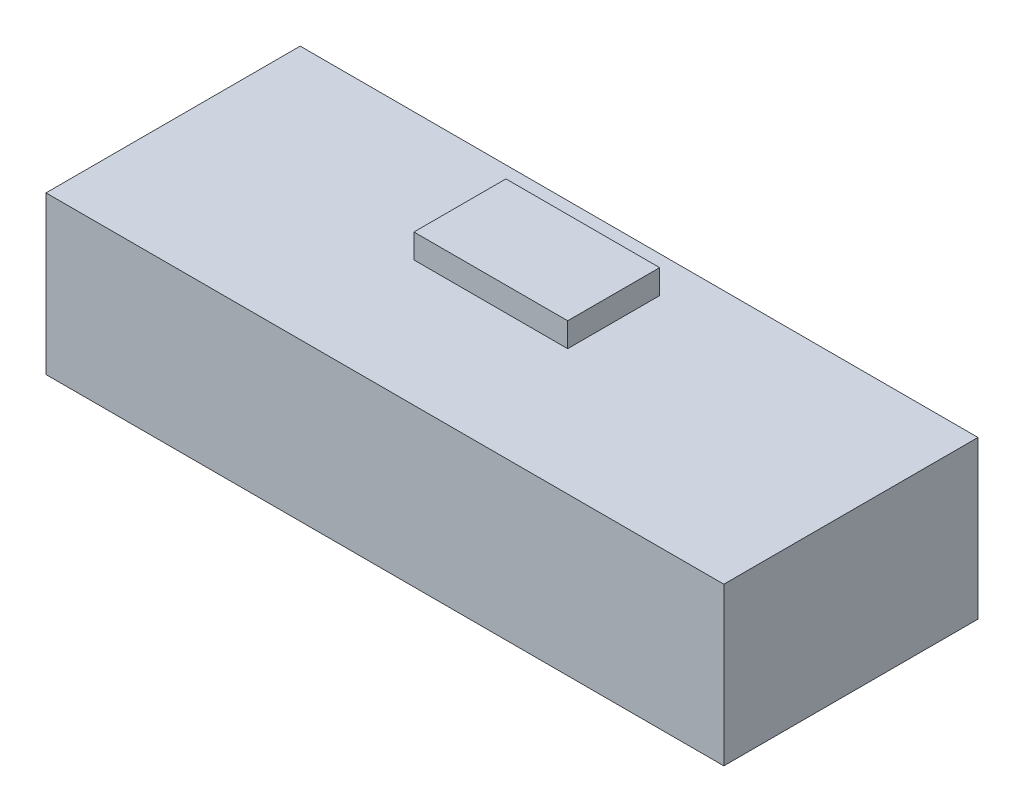
ISO-10303-21;
HEADER;
FILE_DESCRIPTION(('STEP AP214'),'2;1');
FILE_NAME('part.step','',(''),(''),'','','');
FILE_SCHEMA(('AUTOMOTIVE_DESIGN { 1 0 10303 214 1 1 1 1 }'));
ENDSEC;
DATA;
#1=APPLICATION_CONTEXT('core data for automotive mechanical design processes');
#2=APPLICATION_PROTOCOL_DEFINITION('international standard','automotive_design',2000,#1);
#3=PRODUCT_CONTEXT('',#1,'mechanical');
#4=PRODUCT('Part','Part','',(#3));
#5=PRODUCT_RELATED_PRODUCT_CATEGORY('part','',(#4));
#6=PRODUCT_DEFINITION_FORMATION('','',#4);
#7=PRODUCT_DEFINITION_CONTEXT('part definition',#1,'design');
#8=PRODUCT_DEFINITION('design','',#6,#7);
#9=PRODUCT_DEFINITION_SHAPE('','',#8);
#10=(LENGTH_UNIT() NAMED_UNIT(*) SI_UNIT(.MILLI.,.METRE.));
#11=(NAMED_UNIT(*) PLANE_ANGLE_UNIT() SI_UNIT($,.RADIAN.));
#12=(NAMED_UNIT(*) SI_UNIT($,.STERADIAN.) SOLID_ANGLE_UNIT());
#13=UNCERTAINTY_MEASURE_WITH_UNIT(LENGTH_MEASURE(1.E-05),#10,'distance_accuracy_value','');
#14=(GEOMETRIC_REPRESENTATION_CONTEXT(3) GLOBAL_UNCERTAINTY_ASSIGNED_CONTEXT((#13)) GLOBAL_UNIT_ASSIGNED_CONTEXT((#10,
#11,#12)) REPRESENTATION_CONTEXT('',''));
#15=CARTESIAN_POINT('',(0.,0.,0.));
#16=DIRECTION('',(0.,0.,1.));
#17=DIRECTION('',(1.,0.,0.));
#18=AXIS2_PLACEMENT_3D('',#15,#16,#17);
#19=CARTESIAN_POINT('',(-28.,13.,-10.5));
#20=DIRECTION('',(1.,0.,0.));
#21=DIRECTION('',(0.,0.,-1.));
#22=AXIS2_PLACEMENT_3D('',#19,#20,#21);
#23=PLANE('',#22);
#24=DIRECTION('',(0.,0.,1.));
#25=VECTOR('',#24,1.);
#26=CARTESIAN_POINT('',(-28.,0.,-10.5));
#27=LINE('',#26,#25);
#28=CARTESIAN_POINT('',(-28.,0.,-10.5));
#29=VERTEX_POINT('',#28);
#30=CARTESIAN_POINT('',(-28.,0.,10.5));
#31=VERTEX_POINT('',#30);
#32=EDGE_CURVE('E130',#29,#31,#27,.T.);
#33=ORIENTED_EDGE('',*,*,#32,.T.);
#34=DIRECTION('',(0.,-1.,0.));
#35=VECTOR('',#34,1.);
#36=CARTESIAN_POINT('',(-28.,13.,10.5));
#37=LINE('',#36,#35);
#38=CARTESIAN_POINT('',(-28.,13.,10.5));
#39=VERTEX_POINT('',#38);
#40=EDGE_CURVE('E11',#39,#31,#37,.T.);
#41=ORIENTED_EDGE('',*,*,#40,.F.);
#42=DIRECTION('',(0.,0.,1.));
#43=VECTOR('',#42,1.);
#44=CARTESIAN_POINT('',(-28.,13.,-10.5));
#45=LINE('',#44,#43);
#46=CARTESIAN_POINT('',(-28.,13.,-10.5));
#47=VERTEX_POINT('',#46);
#48=EDGE_CURVE('E136',#47,#39,#45,.T.);
#49=ORIENTED_EDGE('',*,*,#48,.F.);
#50=DIRECTION('',(0.,-1.,0.));
#51=VECTOR('',#50,1.);
#52=CARTESIAN_POINT('',(-28.,13.,-10.5));
#53=LINE('',#52,#51);
#54=EDGE_CURVE('E144',#47,#29,#53,.T.);
#55=ORIENTED_EDGE('',*,*,#54,.T.);
#56=EDGE_LOOP('',(#33,#41,#49,#55));
#57=FACE_BOUND('',#56,.T.);
#58=ADVANCED_FACE('F43',(#57),#23,.F.);
#59=CARTESIAN_POINT('',(-28.,13.,10.5));
#60=DIRECTION('',(0.,0.,-1.));
#61=DIRECTION('',(-1.,0.,0.));
#62=AXIS2_PLACEMENT_3D('',#59,#60,#61);
#63=PLANE('',#62);
#64=DIRECTION('',(1.,0.,0.));
#65=VECTOR('',#64,1.);
#66=CARTESIAN_POINT('',(-28.,0.,10.5));
#67=LINE('',#66,#65);
#68=CARTESIAN_POINT('',(28.,0.,10.5));
#69=VERTEX_POINT('',#68);
#70=EDGE_CURVE('E128',#31,#69,#67,.T.);
#71=ORIENTED_EDGE('',*,*,#70,.T.);
#72=DIRECTION('',(0.,-1.,0.));
#73=VECTOR('',#72,1.);
#74=CARTESIAN_POINT('',(28.,13.,10.5));
#75=LINE('',#74,#73);
#76=CARTESIAN_POINT('',(28.,13.,10.5));
#77=VERTEX_POINT('',#76);
#78=EDGE_CURVE('E49',#77,#69,#75,.T.);
#79=ORIENTED_EDGE('',*,*,#78,.F.);
#80=DIRECTION('',(1.,0.,0.));
#81=VECTOR('',#80,1.);
#82=CARTESIAN_POINT('',(-28.,13.,10.5));
#83=LINE('',#82,#81);
#84=EDGE_CURVE('E138',#39,#77,#83,.T.);
#85=ORIENTED_EDGE('',*,*,#84,.F.);
#86=ORIENTED_EDGE('',*,*,#40,.T.);
#87=EDGE_LOOP('',(#71,#79,#85,#86));
#88=FACE_BOUND('',#87,.T.);
#89=ADVANCED_FACE('F176',(#88),#63,.F.);
#90=CARTESIAN_POINT('',(28.,13.,10.5));
#91=DIRECTION('',(-1.,0.,0.));
#92=DIRECTION('',(0.,0.,1.));
#93=AXIS2_PLACEMENT_3D('',#90,#91,#92);
#94=PLANE('',#93);
#95=DIRECTION('',(0.,0.,-1.));
#96=VECTOR('',#95,1.);
#97=CARTESIAN_POINT('',(28.,0.,10.5));
#98=LINE('',#97,#96);
#99=CARTESIAN_POINT('',(28.,0.,-10.5));
#100=VERTEX_POINT('',#99);
#101=EDGE_CURVE('E146',#69,#100,#98,.T.);
#102=ORIENTED_EDGE('',*,*,#101,.T.);
#103=DIRECTION('',(0.,-1.,0.));
#104=VECTOR('',#103,1.);
#105=CARTESIAN_POINT('',(28.,13.,-10.5));
#106=LINE('',#105,#104);
#107=CARTESIAN_POINT('',(28.,13.,-10.5));
#108=VERTEX_POINT('',#107);
#109=EDGE_CURVE('E153',#108,#100,#106,.T.);
#110=ORIENTED_EDGE('',*,*,#109,.F.);
#111=DIRECTION('',(0.,0.,-1.));
#112=VECTOR('',#111,1.);
#113=CARTESIAN_POINT('',(28.,13.,10.5));
#114=LINE('',#113,#112);
#115=EDGE_CURVE('E142',#77,#108,#114,.T.);
#116=ORIENTED_EDGE('',*,*,#115,.F.);
#117=ORIENTED_EDGE('',*,*,#78,.T.);
#118=EDGE_LOOP('',(#102,#110,#116,#117));
#119=FACE_BOUND('',#118,.T.);
#120=ADVANCED_FACE('F159',(#119),#94,.F.);
#121=CARTESIAN_POINT('',(28.,13.,-10.5));
#122=DIRECTION('',(0.,0.,1.));
#123=DIRECTION('',(1.,0.,0.));
#124=AXIS2_PLACEMENT_3D('',#121,#122,#123);
#125=PLANE('',#124);
#126=DIRECTION('',(-1.,0.,0.));
#127=VECTOR('',#126,1.);
#128=CARTESIAN_POINT('',(28.,0.,-10.5));
#129=LINE('',#128,#127);
#130=EDGE_CURVE('E139',#100,#29,#129,.T.);
#131=ORIENTED_EDGE('',*,*,#130,.T.);
#132=ORIENTED_EDGE('',*,*,#54,.F.);
#133=DIRECTION('',(-1.,0.,0.));
#134=VECTOR('',#133,1.);
#135=CARTESIAN_POINT('',(28.,13.,-10.5));
#136=LINE('',#135,#134);
#137=EDGE_CURVE('E145',#108,#47,#136,.T.);
#138=ORIENTED_EDGE('',*,*,#137,.F.);
#139=ORIENTED_EDGE('',*,*,#109,.T.);
#140=EDGE_LOOP('',(#131,#132,#138,#139));
#141=FACE_BOUND('',#140,.T.);
#142=ADVANCED_FACE('F166',(#141),#125,.F.);
#143=CARTESIAN_POINT('',(0.,13.,0.));
#144=DIRECTION('',(0.,1.,0.));
#145=DIRECTION('',(0.,0.,1.));
#146=AXIS2_PLACEMENT_3D('',#143,#144,#145);
#147=PLANE('',#146);
#148=DIRECTION('',(0.,0.,1.));
#149=VECTOR('',#148,1.);
#150=CARTESIAN_POINT('',(-8.,13.,-7.5));
#151=LINE('',#150,#149);
#152=CARTESIAN_POINT('',(-8.,13.,-7.5));
#153=VERTEX_POINT('',#152);
#154=CARTESIAN_POINT('',(-8.,13.,0.1));
#155=VERTEX_POINT('',#154);
#156=EDGE_CURVE('E60',#153,#155,#151,.T.);
#157=ORIENTED_EDGE('',*,*,#156,.F.);
#158=DIRECTION('',(-1.,0.,0.));
#159=VECTOR('',#158,1.);
#160=CARTESIAN_POINT('',(4.7,13.,-7.5));
#161=LINE('',#160,#159);
#162=CARTESIAN_POINT('',(4.7,13.,-7.5));
#163=VERTEX_POINT('',#162);
#164=EDGE_CURVE('E62',#163,#153,#161,.T.);
#165=ORIENTED_EDGE('',*,*,#164,.F.);
#166=DIRECTION('',(0.,0.,-1.));
#167=VECTOR('',#166,1.);
#168=CARTESIAN_POINT('',(4.7,13.,0.1));
#169=LINE('',#168,#167);
#170=CARTESIAN_POINT('',(4.7,13.,0.1));
#171=VERTEX_POINT('',#170);
#172=EDGE_CURVE('E314',#171,#163,#169,.T.);
#173=ORIENTED_EDGE('',*,*,#172,.F.);
#174=DIRECTION('',(1.,0.,0.));
#175=VECTOR('',#174,1.);
#176=CARTESIAN_POINT('',(-8.,13.,0.1));
#177=LINE('',#176,#175);
#178=EDGE_CURVE('E319',#155,#171,#177,.T.);
#179=ORIENTED_EDGE('',*,*,#178,.F.);
#180=EDGE_LOOP('',(#157,#165,#173,#179));
#181=FACE_BOUND('',#180,.T.);
#182=ORIENTED_EDGE('',*,*,#48,.T.);
#183=ORIENTED_EDGE('',*,*,#84,.T.);
#184=ORIENTED_EDGE('',*,*,#115,.T.);
#185=ORIENTED_EDGE('',*,*,#137,.T.);
#186=EDGE_LOOP('',(#182,#183,#184,#185));
#187=FACE_BOUND('',#186,.T.);
#188=ADVANCED_FACE('F173',(#181,#187),#147,.T.);
#189=CARTESIAN_POINT('',(0.,0.,0.));
#190=DIRECTION('',(0.,1.,0.));
#191=DIRECTION('',(0.,0.,1.));
#192=AXIS2_PLACEMENT_3D('',#189,#190,#191);
#193=PLANE('',#192);
#194=ORIENTED_EDGE('',*,*,#32,.F.);
#195=ORIENTED_EDGE('',*,*,#130,.F.);
#196=ORIENTED_EDGE('',*,*,#101,.F.);
#197=ORIENTED_EDGE('',*,*,#70,.F.);
#198=EDGE_LOOP('',(#194,#195,#196,#197));
#199=FACE_BOUND('',#198,.T.);
#200=ADVANCED_FACE('F167',(#199),#193,.F.);
#201=CARTESIAN_POINT('',(-8.,15.,-7.5));
#202=DIRECTION('',(1.,0.,0.));
#203=DIRECTION('',(0.,0.,-1.));
#204=AXIS2_PLACEMENT_3D('',#201,#202,#203);
#205=PLANE('',#204);
#206=ORIENTED_EDGE('',*,*,#156,.T.);
#207=DIRECTION('',(0.,-1.,0.));
#208=VECTOR('',#207,1.);
#209=CARTESIAN_POINT('',(-8.,15.,0.1));
#210=LINE('',#209,#208);
#211=CARTESIAN_POINT('',(-8.,15.,0.1));
#212=VERTEX_POINT('',#211);
#213=EDGE_CURVE('E109',#212,#155,#210,.T.);
#214=ORIENTED_EDGE('',*,*,#213,.F.);
#215=DIRECTION('',(0.,0.,1.));
#216=VECTOR('',#215,1.);
#217=CARTESIAN_POINT('',(-8.,15.,-7.5));
#218=LINE('',#217,#216);
#219=CARTESIAN_POINT('',(-8.,15.,-7.5));
#220=VERTEX_POINT('',#219);
#221=EDGE_CURVE('E117',#220,#212,#218,.T.);
#222=ORIENTED_EDGE('',*,*,#221,.F.);
#223=DIRECTION('',(0.,-1.,0.));
#224=VECTOR('',#223,1.);
#225=CARTESIAN_POINT('',(-8.,15.,-7.5));
#226=LINE('',#225,#224);
#227=EDGE_CURVE('E315',#220,#153,#226,.T.);
#228=ORIENTED_EDGE('',*,*,#227,.T.);
#229=EDGE_LOOP('',(#206,#214,#222,#228));
#230=FACE_BOUND('',#229,.T.);
#231=ADVANCED_FACE('F127',(#230),#205,.F.);
#232=CARTESIAN_POINT('',(-8.,15.,0.1));
#233=DIRECTION('',(0.,0.,-1.));
#234=DIRECTION('',(-1.,0.,0.));
#235=AXIS2_PLACEMENT_3D('',#232,#233,#234);
#236=PLANE('',#235);
#237=ORIENTED_EDGE('',*,*,#178,.T.);
#238=DIRECTION('',(0.,-1.,0.));
#239=VECTOR('',#238,1.);
#240=CARTESIAN_POINT('',(4.7,15.,0.1));
#241=LINE('',#240,#239);
#242=CARTESIAN_POINT('',(4.7,15.,0.1));
#243=VERTEX_POINT('',#242);
#244=EDGE_CURVE('E115',#243,#171,#241,.T.);
#245=ORIENTED_EDGE('',*,*,#244,.F.);
#246=DIRECTION('',(1.,0.,0.));
#247=VECTOR('',#246,1.);
#248=CARTESIAN_POINT('',(-8.,15.,0.1));
#249=LINE('',#248,#247);
#250=EDGE_CURVE('E104',#212,#243,#249,.T.);
#251=ORIENTED_EDGE('',*,*,#250,.F.);
#252=ORIENTED_EDGE('',*,*,#213,.T.);
#253=EDGE_LOOP('',(#237,#245,#251,#252));
#254=FACE_BOUND('',#253,.T.);
#255=ADVANCED_FACE('F107',(#254),#236,.F.);
#256=CARTESIAN_POINT('',(4.7,15.,0.1));
#257=DIRECTION('',(-1.,0.,0.));
#258=DIRECTION('',(0.,0.,1.));
#259=AXIS2_PLACEMENT_3D('',#256,#257,#258);
#260=PLANE('',#259);
#261=ORIENTED_EDGE('',*,*,#172,.T.);
#262=DIRECTION('',(0.,-1.,0.));
#263=VECTOR('',#262,1.);
#264=CARTESIAN_POINT('',(4.7,15.,-7.5));
#265=LINE('',#264,#263);
#266=CARTESIAN_POINT('',(4.7,15.,-7.5));
#267=VERTEX_POINT('',#266);
#268=EDGE_CURVE('E135',#267,#163,#265,.T.);
#269=ORIENTED_EDGE('',*,*,#268,.F.);
#270=DIRECTION('',(0.,0.,-1.));
#271=VECTOR('',#270,1.);
#272=CARTESIAN_POINT('',(4.7,15.,0.1));
#273=LINE('',#272,#271);
#274=EDGE_CURVE('E113',#243,#267,#273,.T.);
#275=ORIENTED_EDGE('',*,*,#274,.F.);
#276=ORIENTED_EDGE('',*,*,#244,.T.);
#277=EDGE_LOOP('',(#261,#269,#275,#276));
#278=FACE_BOUND('',#277,.T.);
#279=ADVANCED_FACE('F193',(#278),#260,.F.);
#280=CARTESIAN_POINT('',(4.7,15.,-7.5));
#281=DIRECTION('',(0.,0.,1.));
#282=DIRECTION('',(1.,0.,0.));
#283=AXIS2_PLACEMENT_3D('',#280,#281,#282);
#284=PLANE('',#283);
#285=ORIENTED_EDGE('',*,*,#164,.T.);
#286=ORIENTED_EDGE('',*,*,#227,.F.);
#287=DIRECTION('',(-1.,0.,0.));
#288=VECTOR('',#287,1.);
#289=CARTESIAN_POINT('',(4.7,15.,-7.5));
#290=LINE('',#289,#288);
#291=EDGE_CURVE('E121',#267,#220,#290,.T.);
#292=ORIENTED_EDGE('',*,*,#291,.F.);
#293=ORIENTED_EDGE('',*,*,#268,.T.);
#294=EDGE_LOOP('',(#285,#286,#292,#293));
#295=FACE_BOUND('',#294,.T.);
#296=ADVANCED_FACE('F197',(#295),#284,.F.);
#297=CARTESIAN_POINT('',(0.,15.,0.));
#298=DIRECTION('',(0.,1.,0.));
#299=DIRECTION('',(0.,0.,1.));
#300=AXIS2_PLACEMENT_3D('',#297,#298,#299);
#301=PLANE('',#300);
#302=ORIENTED_EDGE('',*,*,#221,.T.);
#303=ORIENTED_EDGE('',*,*,#250,.T.);
#304=ORIENTED_EDGE('',*,*,#274,.T.);
#305=ORIENTED_EDGE('',*,*,#291,.T.);
#306=EDGE_LOOP('',(#302,#303,#304,#305));
#307=FACE_BOUND('',#306,.T.);
#308=ADVANCED_FACE('F116',(#307),#301,.T.);
#309=CLOSED_SHELL('',(#58,#89,#120,#142,#188,#200,#231,#255,#279,#296,#308));
#310=MANIFOLD_SOLID_BREP('B2',#309);
#311=ADVANCED_BREP_SHAPE_REPRESENTATION('',(#18,#310),#14);
#312=SHAPE_DEFINITION_REPRESENTATION(#9,#311);
ENDSEC;
END-ISO-10303-21;
